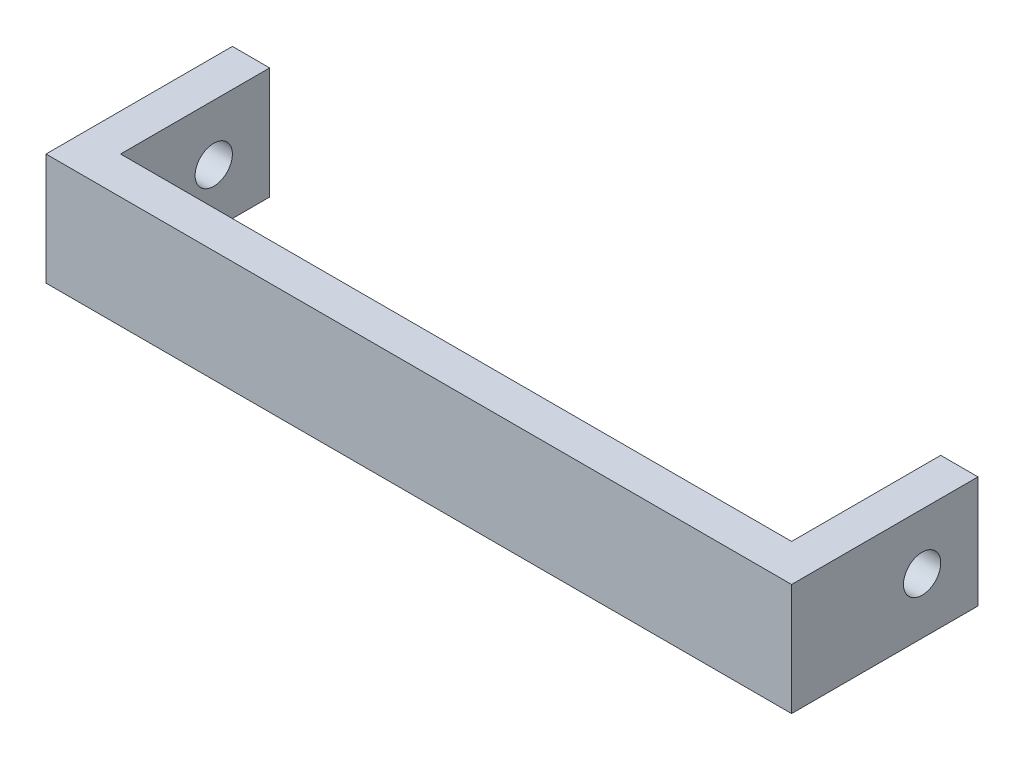
ISO-10303-21;
HEADER;
FILE_DESCRIPTION(('STEP AP214'),'2;1');
FILE_NAME('part.step','',(''),(''),'','','');
FILE_SCHEMA(('AUTOMOTIVE_DESIGN { 1 0 10303 214 1 1 1 1 }'));
ENDSEC;
DATA;
#1=APPLICATION_CONTEXT('core data for automotive mechanical design processes');
#2=APPLICATION_PROTOCOL_DEFINITION('international standard','automotive_design',2000,#1);
#3=PRODUCT_CONTEXT('',#1,'mechanical');
#4=PRODUCT('Part','Part','',(#3));
#5=PRODUCT_RELATED_PRODUCT_CATEGORY('part','',(#4));
#6=PRODUCT_DEFINITION_FORMATION('','',#4);
#7=PRODUCT_DEFINITION_CONTEXT('part definition',#1,'design');
#8=PRODUCT_DEFINITION('design','',#6,#7);
#9=PRODUCT_DEFINITION_SHAPE('','',#8);
#10=(LENGTH_UNIT() NAMED_UNIT(*) SI_UNIT(.MILLI.,.METRE.));
#11=(NAMED_UNIT(*) PLANE_ANGLE_UNIT() SI_UNIT($,.RADIAN.));
#12=(NAMED_UNIT(*) SI_UNIT($,.STERADIAN.) SOLID_ANGLE_UNIT());
#13=UNCERTAINTY_MEASURE_WITH_UNIT(LENGTH_MEASURE(1.E-05),#10,'distance_accuracy_value','');
#14=(GEOMETRIC_REPRESENTATION_CONTEXT(3) GLOBAL_UNCERTAINTY_ASSIGNED_CONTEXT((#13)) GLOBAL_UNIT_ASSIGNED_CONTEXT((#10,
#11,#12)) REPRESENTATION_CONTEXT('',''));
#15=CARTESIAN_POINT('',(0.,0.,0.));
#16=DIRECTION('',(0.,0.,1.));
#17=DIRECTION('',(1.,0.,0.));
#18=AXIS2_PLACEMENT_3D('',#15,#16,#17);
#19=CARTESIAN_POINT('',(50.,15.,0.));
#20=DIRECTION('',(1.,0.,0.));
#21=DIRECTION('',(0.,0.,-1.));
#22=AXIS2_PLACEMENT_3D('',#19,#20,#21);
#23=PLANE('',#22);
#24=CARTESIAN_POINT('',(50.,7.5,-15.));
#25=DIRECTION('',(-1.,0.,0.));
#26=DIRECTION('',(0.,0.,1.));
#27=AXIS2_PLACEMENT_3D('',#24,#25,#26);
#28=CIRCLE('',#27,2.5);
#29=CARTESIAN_POINT('',(50.,7.5,-12.5));
#30=VERTEX_POINT('',#29);
#31=EDGE_CURVE('E222',#30,#30,#28,.T.);
#32=ORIENTED_EDGE('',*,*,#31,.T.);
#33=EDGE_LOOP('',(#32));
#34=FACE_BOUND('',#33,.T.);
#35=DIRECTION('',(0.,0.,1.));
#36=VECTOR('',#35,1.);
#37=CARTESIAN_POINT('',(50.,0.,0.));
#38=LINE('',#37,#36);
#39=CARTESIAN_POINT('',(50.,0.,-22.5));
#40=VERTEX_POINT('',#39);
#41=CARTESIAN_POINT('',(50.,0.,2.5));
#42=VERTEX_POINT('',#41);
#43=EDGE_CURVE('E148',#40,#42,#38,.T.);
#44=ORIENTED_EDGE('',*,*,#43,.F.);
#45=DIRECTION('',(0.,-1.,0.));
#46=VECTOR('',#45,1.);
#47=CARTESIAN_POINT('',(50.,15.,-22.5));
#48=LINE('',#47,#46);
#49=CARTESIAN_POINT('',(50.,15.,-22.5));
#50=VERTEX_POINT('',#49);
#51=EDGE_CURVE('E11',#50,#40,#48,.T.);
#52=ORIENTED_EDGE('',*,*,#51,.F.);
#53=DIRECTION('',(0.,0.,1.));
#54=VECTOR('',#53,1.);
#55=CARTESIAN_POINT('',(50.,15.,0.));
#56=LINE('',#55,#54);
#57=CARTESIAN_POINT('',(50.,15.,2.5));
#58=VERTEX_POINT('',#57);
#59=EDGE_CURVE('E176',#50,#58,#56,.T.);
#60=ORIENTED_EDGE('',*,*,#59,.T.);
#61=DIRECTION('',(0.,-1.,0.));
#62=VECTOR('',#61,1.);
#63=CARTESIAN_POINT('',(50.,15.,2.5));
#64=LINE('',#63,#62);
#65=EDGE_CURVE('E98',#58,#42,#64,.T.);
#66=ORIENTED_EDGE('',*,*,#65,.T.);
#67=EDGE_LOOP('',(#44,#52,#60,#66));
#68=FACE_BOUND('',#67,.T.);
#69=ADVANCED_FACE('F47',(#34,#68),#23,.T.);
#70=CARTESIAN_POINT('',(0.,15.,-22.5));
#71=DIRECTION('',(0.,0.,1.));
#72=DIRECTION('',(1.,0.,0.));
#73=AXIS2_PLACEMENT_3D('',#70,#71,#72);
#74=PLANE('',#73);
#75=DIRECTION('',(-1.,0.,0.));
#76=VECTOR('',#75,1.);
#77=CARTESIAN_POINT('',(0.,0.,-22.5));
#78=LINE('',#77,#76);
#79=CARTESIAN_POINT('',(45.,0.,-22.5));
#80=VERTEX_POINT('',#79);
#81=EDGE_CURVE('E152',#40,#80,#78,.T.);
#82=ORIENTED_EDGE('',*,*,#81,.T.);
#83=DIRECTION('',(0.,-1.,0.));
#84=VECTOR('',#83,1.);
#85=CARTESIAN_POINT('',(45.,15.,-22.5));
#86=LINE('',#85,#84);
#87=CARTESIAN_POINT('',(45.,15.,-22.5));
#88=VERTEX_POINT('',#87);
#89=EDGE_CURVE('E56',#88,#80,#86,.T.);
#90=ORIENTED_EDGE('',*,*,#89,.F.);
#91=DIRECTION('',(-1.,0.,0.));
#92=VECTOR('',#91,1.);
#93=CARTESIAN_POINT('',(0.,15.,-22.5));
#94=LINE('',#93,#92);
#95=EDGE_CURVE('E206',#50,#88,#94,.T.);
#96=ORIENTED_EDGE('',*,*,#95,.F.);
#97=ORIENTED_EDGE('',*,*,#51,.T.);
#98=EDGE_LOOP('',(#82,#90,#96,#97));
#99=FACE_BOUND('',#98,.T.);
#100=ADVANCED_FACE('F198',(#99),#74,.F.);
#101=CARTESIAN_POINT('',(45.,15.,0.));
#102=DIRECTION('',(-1.,0.,0.));
#103=DIRECTION('',(0.,0.,1.));
#104=AXIS2_PLACEMENT_3D('',#101,#102,#103);
#105=PLANE('',#104);
#106=CARTESIAN_POINT('',(45.,7.5,-15.));
#107=DIRECTION('',(-1.,0.,0.));
#108=DIRECTION('',(0.,0.,1.));
#109=AXIS2_PLACEMENT_3D('',#106,#107,#108);
#110=CIRCLE('',#109,2.5);
#111=CARTESIAN_POINT('',(45.,7.5,-12.5));
#112=VERTEX_POINT('',#111);
#113=EDGE_CURVE('E153',#112,#112,#110,.T.);
#114=ORIENTED_EDGE('',*,*,#113,.F.);
#115=EDGE_LOOP('',(#114));
#116=FACE_BOUND('',#115,.T.);
#117=DIRECTION('',(0.,0.,-1.));
#118=VECTOR('',#117,1.);
#119=CARTESIAN_POINT('',(45.,0.,0.));
#120=LINE('',#119,#118);
#121=CARTESIAN_POINT('',(45.,0.,-2.5));
#122=VERTEX_POINT('',#121);
#123=EDGE_CURVE('E157',#122,#80,#120,.T.);
#124=ORIENTED_EDGE('',*,*,#123,.F.);
#125=DIRECTION('',(0.,-1.,0.));
#126=VECTOR('',#125,1.);
#127=CARTESIAN_POINT('',(45.,15.,-2.5));
#128=LINE('',#127,#126);
#129=CARTESIAN_POINT('',(45.,15.,-2.5));
#130=VERTEX_POINT('',#129);
#131=EDGE_CURVE('E186',#130,#122,#128,.T.);
#132=ORIENTED_EDGE('',*,*,#131,.F.);
#133=DIRECTION('',(0.,0.,-1.));
#134=VECTOR('',#133,1.);
#135=CARTESIAN_POINT('',(45.,15.,0.));
#136=LINE('',#135,#134);
#137=EDGE_CURVE('E195',#130,#88,#136,.T.);
#138=ORIENTED_EDGE('',*,*,#137,.T.);
#139=ORIENTED_EDGE('',*,*,#89,.T.);
#140=EDGE_LOOP('',(#124,#132,#138,#139));
#141=FACE_BOUND('',#140,.T.);
#142=ADVANCED_FACE('F193',(#116,#141),#105,.T.);
#143=CARTESIAN_POINT('',(0.,15.,-2.5));
#144=DIRECTION('',(0.,0.,-1.));
#145=DIRECTION('',(-1.,0.,0.));
#146=AXIS2_PLACEMENT_3D('',#143,#144,#145);
#147=PLANE('',#146);
#148=DIRECTION('',(1.,0.,0.));
#149=VECTOR('',#148,1.);
#150=CARTESIAN_POINT('',(0.,0.,-2.5));
#151=LINE('',#150,#149);
#152=CARTESIAN_POINT('',(-45.,0.,-2.5));
#153=VERTEX_POINT('',#152);
#154=EDGE_CURVE('E161',#153,#122,#151,.T.);
#155=ORIENTED_EDGE('',*,*,#154,.F.);
#156=DIRECTION('',(0.,-1.,0.));
#157=VECTOR('',#156,1.);
#158=CARTESIAN_POINT('',(-45.,15.,-2.5));
#159=LINE('',#158,#157);
#160=CARTESIAN_POINT('',(-45.,15.,-2.5));
#161=VERTEX_POINT('',#160);
#162=EDGE_CURVE('E183',#161,#153,#159,.T.);
#163=ORIENTED_EDGE('',*,*,#162,.F.);
#164=DIRECTION('',(1.,0.,0.));
#165=VECTOR('',#164,1.);
#166=CARTESIAN_POINT('',(0.,15.,-2.5));
#167=LINE('',#166,#165);
#168=EDGE_CURVE('E142',#161,#130,#167,.T.);
#169=ORIENTED_EDGE('',*,*,#168,.T.);
#170=ORIENTED_EDGE('',*,*,#131,.T.);
#171=EDGE_LOOP('',(#155,#163,#169,#170));
#172=FACE_BOUND('',#171,.T.);
#173=ADVANCED_FACE('F204',(#172),#147,.T.);
#174=CARTESIAN_POINT('',(-45.,15.,0.));
#175=DIRECTION('',(-1.,0.,0.));
#176=DIRECTION('',(0.,0.,1.));
#177=AXIS2_PLACEMENT_3D('',#174,#175,#176);
#178=PLANE('',#177);
#179=CARTESIAN_POINT('',(-45.,7.5,-15.));
#180=DIRECTION('',(-1.,0.,0.));
#181=DIRECTION('',(0.,0.,1.));
#182=AXIS2_PLACEMENT_3D('',#179,#180,#181);
#183=CIRCLE('',#182,2.5);
#184=CARTESIAN_POINT('',(-45.,7.5,-12.5));
#185=VERTEX_POINT('',#184);
#186=EDGE_CURVE('E218',#185,#185,#183,.T.);
#187=ORIENTED_EDGE('',*,*,#186,.T.);
#188=EDGE_LOOP('',(#187));
#189=FACE_BOUND('',#188,.T.);
#190=DIRECTION('',(0.,0.,-1.));
#191=VECTOR('',#190,1.);
#192=CARTESIAN_POINT('',(-45.,0.,0.));
#193=LINE('',#192,#191);
#194=CARTESIAN_POINT('',(-45.,0.,-22.5));
#195=VERTEX_POINT('',#194);
#196=EDGE_CURVE('E165',#153,#195,#193,.T.);
#197=ORIENTED_EDGE('',*,*,#196,.T.);
#198=DIRECTION('',(0.,-1.,0.));
#199=VECTOR('',#198,1.);
#200=CARTESIAN_POINT('',(-45.,15.,-22.5));
#201=LINE('',#200,#199);
#202=CARTESIAN_POINT('',(-45.,15.,-22.5));
#203=VERTEX_POINT('',#202);
#204=EDGE_CURVE('E127',#203,#195,#201,.T.);
#205=ORIENTED_EDGE('',*,*,#204,.F.);
#206=DIRECTION('',(0.,0.,-1.));
#207=VECTOR('',#206,1.);
#208=CARTESIAN_POINT('',(-45.,15.,0.));
#209=LINE('',#208,#207);
#210=EDGE_CURVE('E137',#161,#203,#209,.T.);
#211=ORIENTED_EDGE('',*,*,#210,.F.);
#212=ORIENTED_EDGE('',*,*,#162,.T.);
#213=EDGE_LOOP('',(#197,#205,#211,#212));
#214=FACE_BOUND('',#213,.T.);
#215=ADVANCED_FACE('F255',(#189,#214),#178,.F.);
#216=CARTESIAN_POINT('',(0.,15.,-22.5));
#217=DIRECTION('',(0.,0.,-1.));
#218=DIRECTION('',(-1.,0.,0.));
#219=AXIS2_PLACEMENT_3D('',#216,#217,#218);
#220=PLANE('',#219);
#221=DIRECTION('',(1.,0.,0.));
#222=VECTOR('',#221,1.);
#223=CARTESIAN_POINT('',(0.,0.,-22.5));
#224=LINE('',#223,#222);
#225=CARTESIAN_POINT('',(-50.,0.,-22.5));
#226=VERTEX_POINT('',#225);
#227=EDGE_CURVE('E125',#226,#195,#224,.T.);
#228=ORIENTED_EDGE('',*,*,#227,.F.);
#229=DIRECTION('',(0.,-1.,0.));
#230=VECTOR('',#229,1.);
#231=CARTESIAN_POINT('',(-50.,15.,-22.5));
#232=LINE('',#231,#230);
#233=CARTESIAN_POINT('',(-50.,15.,-22.5));
#234=VERTEX_POINT('',#233);
#235=EDGE_CURVE('E119',#234,#226,#232,.T.);
#236=ORIENTED_EDGE('',*,*,#235,.F.);
#237=DIRECTION('',(1.,0.,0.));
#238=VECTOR('',#237,1.);
#239=CARTESIAN_POINT('',(0.,15.,-22.5));
#240=LINE('',#239,#238);
#241=EDGE_CURVE('E123',#234,#203,#240,.T.);
#242=ORIENTED_EDGE('',*,*,#241,.T.);
#243=ORIENTED_EDGE('',*,*,#204,.T.);
#244=EDGE_LOOP('',(#228,#236,#242,#243));
#245=FACE_BOUND('',#244,.T.);
#246=ADVANCED_FACE('F121',(#245),#220,.T.);
#247=CARTESIAN_POINT('',(-50.,15.,0.));
#248=DIRECTION('',(1.,0.,0.));
#249=DIRECTION('',(0.,0.,-1.));
#250=AXIS2_PLACEMENT_3D('',#247,#248,#249);
#251=PLANE('',#250);
#252=CARTESIAN_POINT('',(-50.,7.5,-15.));
#253=DIRECTION('',(-1.,0.,0.));
#254=DIRECTION('',(0.,0.,1.));
#255=AXIS2_PLACEMENT_3D('',#252,#253,#254);
#256=CIRCLE('',#255,2.5);
#257=CARTESIAN_POINT('',(-50.,7.5,-12.5));
#258=VERTEX_POINT('',#257);
#259=EDGE_CURVE('E223',#258,#258,#256,.T.);
#260=ORIENTED_EDGE('',*,*,#259,.F.);
#261=EDGE_LOOP('',(#260));
#262=FACE_BOUND('',#261,.T.);
#263=DIRECTION('',(0.,0.,1.));
#264=VECTOR('',#263,1.);
#265=CARTESIAN_POINT('',(-50.,0.,0.));
#266=LINE('',#265,#264);
#267=CARTESIAN_POINT('',(-50.,0.,2.5));
#268=VERTEX_POINT('',#267);
#269=EDGE_CURVE('E91',#226,#268,#266,.T.);
#270=ORIENTED_EDGE('',*,*,#269,.T.);
#271=DIRECTION('',(0.,-1.,0.));
#272=VECTOR('',#271,1.);
#273=CARTESIAN_POINT('',(-50.,15.,2.5));
#274=LINE('',#273,#272);
#275=CARTESIAN_POINT('',(-50.,15.,2.5));
#276=VERTEX_POINT('',#275);
#277=EDGE_CURVE('E128',#276,#268,#274,.T.);
#278=ORIENTED_EDGE('',*,*,#277,.F.);
#279=DIRECTION('',(0.,0.,1.));
#280=VECTOR('',#279,1.);
#281=CARTESIAN_POINT('',(-50.,15.,0.));
#282=LINE('',#281,#280);
#283=EDGE_CURVE('E130',#234,#276,#282,.T.);
#284=ORIENTED_EDGE('',*,*,#283,.F.);
#285=ORIENTED_EDGE('',*,*,#235,.T.);
#286=EDGE_LOOP('',(#270,#278,#284,#285));
#287=FACE_BOUND('',#286,.T.);
#288=ADVANCED_FACE('F131',(#262,#287),#251,.F.);
#289=CARTESIAN_POINT('',(0.,15.,2.5));
#290=DIRECTION('',(0.,0.,-1.));
#291=DIRECTION('',(-1.,0.,0.));
#292=AXIS2_PLACEMENT_3D('',#289,#290,#291);
#293=PLANE('',#292);
#294=DIRECTION('',(1.,0.,0.));
#295=VECTOR('',#294,1.);
#296=CARTESIAN_POINT('',(0.,0.,2.5));
#297=LINE('',#296,#295);
#298=EDGE_CURVE('E173',#268,#42,#297,.T.);
#299=ORIENTED_EDGE('',*,*,#298,.T.);
#300=ORIENTED_EDGE('',*,*,#65,.F.);
#301=DIRECTION('',(1.,0.,0.));
#302=VECTOR('',#301,1.);
#303=CARTESIAN_POINT('',(0.,15.,2.5));
#304=LINE('',#303,#302);
#305=EDGE_CURVE('E64',#276,#58,#304,.T.);
#306=ORIENTED_EDGE('',*,*,#305,.F.);
#307=ORIENTED_EDGE('',*,*,#277,.T.);
#308=EDGE_LOOP('',(#299,#300,#306,#307));
#309=FACE_BOUND('',#308,.T.);
#310=ADVANCED_FACE('F263',(#309),#293,.F.);
#311=CARTESIAN_POINT('',(0.,15.,0.));
#312=DIRECTION('',(0.,1.,0.));
#313=DIRECTION('',(0.,0.,1.));
#314=AXIS2_PLACEMENT_3D('',#311,#312,#313);
#315=PLANE('',#314);
#316=ORIENTED_EDGE('',*,*,#59,.F.);
#317=ORIENTED_EDGE('',*,*,#95,.T.);
#318=ORIENTED_EDGE('',*,*,#137,.F.);
#319=ORIENTED_EDGE('',*,*,#168,.F.);
#320=ORIENTED_EDGE('',*,*,#210,.T.);
#321=ORIENTED_EDGE('',*,*,#241,.F.);
#322=ORIENTED_EDGE('',*,*,#283,.T.);
#323=ORIENTED_EDGE('',*,*,#305,.T.);
#324=EDGE_LOOP('',(#316,#317,#318,#319,#320,#321,#322,#323));
#325=FACE_BOUND('',#324,.T.);
#326=ADVANCED_FACE('F134',(#325),#315,.T.);
#327=CARTESIAN_POINT('',(0.,0.,0.));
#328=DIRECTION('',(0.,1.,0.));
#329=DIRECTION('',(0.,0.,1.));
#330=AXIS2_PLACEMENT_3D('',#327,#328,#329);
#331=PLANE('',#330);
#332=ORIENTED_EDGE('',*,*,#43,.T.);
#333=ORIENTED_EDGE('',*,*,#298,.F.);
#334=ORIENTED_EDGE('',*,*,#269,.F.);
#335=ORIENTED_EDGE('',*,*,#227,.T.);
#336=ORIENTED_EDGE('',*,*,#196,.F.);
#337=ORIENTED_EDGE('',*,*,#154,.T.);
#338=ORIENTED_EDGE('',*,*,#123,.T.);
#339=ORIENTED_EDGE('',*,*,#81,.F.);
#340=EDGE_LOOP('',(#332,#333,#334,#335,#336,#337,#338,#339));
#341=FACE_BOUND('',#340,.T.);
#342=ADVANCED_FACE('F200',(#341),#331,.F.);
#343=CARTESIAN_POINT('',(50.,7.5,-15.));
#344=DIRECTION('',(-1.,0.,0.));
#345=DIRECTION('',(0.,0.,1.));
#346=AXIS2_PLACEMENT_3D('',#343,#344,#345);
#347=CYLINDRICAL_SURFACE('',#346,2.5);
#348=ORIENTED_EDGE('',*,*,#259,.T.);
#349=EDGE_LOOP('',(#348));
#350=FACE_BOUND('',#349,.T.);
#351=ORIENTED_EDGE('',*,*,#186,.F.);
#352=EDGE_LOOP('',(#351));
#353=FACE_BOUND('',#352,.T.);
#354=ADVANCED_FACE('F234',(#350,#353),#347,.F.);
#355=ORIENTED_EDGE('',*,*,#113,.T.);
#356=EDGE_LOOP('',(#355));
#357=FACE_BOUND('',#356,.T.);
#358=ORIENTED_EDGE('',*,*,#31,.F.);
#359=EDGE_LOOP('',(#358));
#360=FACE_BOUND('',#359,.T.);
#361=ADVANCED_FACE('F232',(#357,#360),#347,.F.);
#362=CLOSED_SHELL('',(#69,#100,#142,#173,#215,#246,#288,#310,#326,#342,#354,#361));
#363=MANIFOLD_SOLID_BREP('B2',#362);
#364=ADVANCED_BREP_SHAPE_REPRESENTATION('',(#18,#363),#14);
#365=SHAPE_DEFINITION_REPRESENTATION(#9,#364);
ENDSEC;
END-ISO-10303-21;
